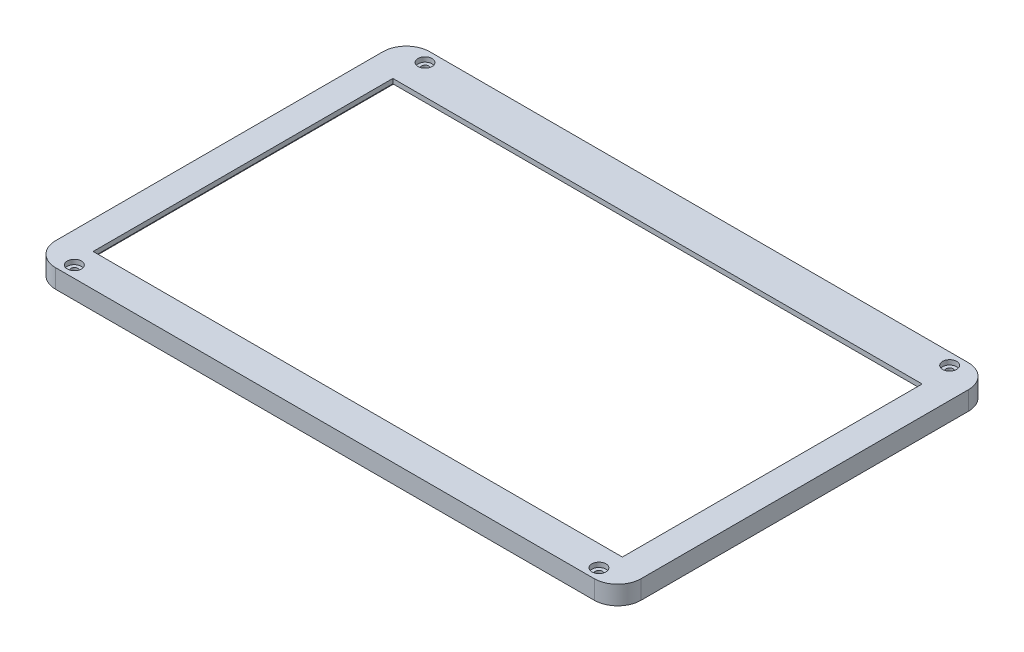
ISO-10303-21;
HEADER;
FILE_DESCRIPTION(('STEP AP214'),'2;1');
FILE_NAME('part.step','',(''),(''),'','','');
FILE_SCHEMA(('AUTOMOTIVE_DESIGN { 1 0 10303 214 1 1 1 1 }'));
ENDSEC;
DATA;
#1=APPLICATION_CONTEXT('core data for automotive mechanical design processes');
#2=APPLICATION_PROTOCOL_DEFINITION('international standard','automotive_design',2000,#1);
#3=PRODUCT_CONTEXT('',#1,'mechanical');
#4=PRODUCT('Part','Part','',(#3));
#5=PRODUCT_RELATED_PRODUCT_CATEGORY('part','',(#4));
#6=PRODUCT_DEFINITION_FORMATION('','',#4);
#7=PRODUCT_DEFINITION_CONTEXT('part definition',#1,'design');
#8=PRODUCT_DEFINITION('design','',#6,#7);
#9=PRODUCT_DEFINITION_SHAPE('','',#8);
#10=(LENGTH_UNIT() NAMED_UNIT(*) SI_UNIT(.MILLI.,.METRE.));
#11=(NAMED_UNIT(*) PLANE_ANGLE_UNIT() SI_UNIT($,.RADIAN.));
#12=(NAMED_UNIT(*) SI_UNIT($,.STERADIAN.) SOLID_ANGLE_UNIT());
#13=UNCERTAINTY_MEASURE_WITH_UNIT(LENGTH_MEASURE(1.E-05),#10,'distance_accuracy_value','');
#14=(GEOMETRIC_REPRESENTATION_CONTEXT(3) GLOBAL_UNCERTAINTY_ASSIGNED_CONTEXT((#13)) GLOBAL_UNIT_ASSIGNED_CONTEXT((#10,
#11,#12)) REPRESENTATION_CONTEXT('',''));
#15=CARTESIAN_POINT('',(0.,0.,0.));
#16=DIRECTION('',(0.,0.,1.));
#17=DIRECTION('',(1.,0.,0.));
#18=AXIS2_PLACEMENT_3D('',#15,#16,#17);
#19=CARTESIAN_POINT('',(-86.3406720741599,10.,87.8980301274625));
#20=DIRECTION('',(0.,-1.,0.));
#21=DIRECTION('',(0.,0.,-1.));
#22=AXIS2_PLACEMENT_3D('',#19,#20,#21);
#23=CYLINDRICAL_SURFACE('',#22,1.5);
#24=CARTESIAN_POINT('',(-86.3406720741599,0.,87.8980301274625));
#25=DIRECTION('',(0.,-1.,0.));
#26=DIRECTION('',(0.,0.,-1.));
#27=AXIS2_PLACEMENT_3D('',#24,#25,#26);
#28=CIRCLE('',#27,1.5);
#29=CARTESIAN_POINT('',(-86.3406720741599,0.,86.3980301274625));
#30=VERTEX_POINT('',#29);
#31=EDGE_CURVE('E338',#30,#30,#28,.T.);
#32=ORIENTED_EDGE('',*,*,#31,.T.);
#33=EDGE_LOOP('',(#32));
#34=FACE_BOUND('',#33,.T.);
#35=CARTESIAN_POINT('',(-86.3406720741599,6.,87.8980301274625));
#36=DIRECTION('',(0.,1.,0.));
#37=DIRECTION('',(0.,0.,1.));
#38=AXIS2_PLACEMENT_3D('',#35,#36,#37);
#39=CIRCLE('',#38,1.5);
#40=CARTESIAN_POINT('',(-86.3406720741599,6.,89.3980301274625));
#41=VERTEX_POINT('',#40);
#42=EDGE_CURVE('E43',#41,#41,#39,.F.);
#43=ORIENTED_EDGE('',*,*,#42,.F.);
#44=EDGE_LOOP('',(#43));
#45=FACE_BOUND('',#44,.T.);
#46=ADVANCED_FACE('F39',(#34,#45),#23,.F.);
#47=CARTESIAN_POINT('',(137.65932792584,10.,87.8980301274625));
#48=DIRECTION('',(0.,-1.,0.));
#49=DIRECTION('',(0.,0.,-1.));
#50=AXIS2_PLACEMENT_3D('',#47,#48,#49);
#51=CYLINDRICAL_SURFACE('',#50,1.5);
#52=CARTESIAN_POINT('',(137.65932792584,0.,87.8980301274625));
#53=DIRECTION('',(0.,-1.,0.));
#54=DIRECTION('',(0.,0.,-1.));
#55=AXIS2_PLACEMENT_3D('',#52,#53,#54);
#56=CIRCLE('',#55,1.5);
#57=CARTESIAN_POINT('',(137.65932792584,0.,86.3980301274625));
#58=VERTEX_POINT('',#57);
#59=EDGE_CURVE('E334',#58,#58,#56,.T.);
#60=ORIENTED_EDGE('',*,*,#59,.T.);
#61=EDGE_LOOP('',(#60));
#62=FACE_BOUND('',#61,.T.);
#63=CARTESIAN_POINT('',(137.65932792584,6.,87.8980301274625));
#64=DIRECTION('',(0.,1.,0.));
#65=DIRECTION('',(0.,0.,1.));
#66=AXIS2_PLACEMENT_3D('',#63,#64,#65);
#67=CIRCLE('',#66,1.5);
#68=CARTESIAN_POINT('',(137.65932792584,6.,89.3980301274625));
#69=VERTEX_POINT('',#68);
#70=EDGE_CURVE('E316',#69,#69,#67,.F.);
#71=ORIENTED_EDGE('',*,*,#70,.F.);
#72=EDGE_LOOP('',(#71));
#73=FACE_BOUND('',#72,.T.);
#74=ADVANCED_FACE('F395',(#62,#73),#51,.F.);
#75=CARTESIAN_POINT('',(137.65932792584,10.,-61.8519698725375));
#76=DIRECTION('',(0.,-1.,0.));
#77=DIRECTION('',(0.,0.,-1.));
#78=AXIS2_PLACEMENT_3D('',#75,#76,#77);
#79=CYLINDRICAL_SURFACE('',#78,1.5);
#80=CARTESIAN_POINT('',(137.65932792584,0.,-61.8519698725375));
#81=DIRECTION('',(0.,-1.,0.));
#82=DIRECTION('',(0.,0.,-1.));
#83=AXIS2_PLACEMENT_3D('',#80,#81,#82);
#84=CIRCLE('',#83,1.5);
#85=CARTESIAN_POINT('',(137.65932792584,0.,-63.3519698725375));
#86=VERTEX_POINT('',#85);
#87=EDGE_CURVE('E328',#86,#86,#84,.T.);
#88=ORIENTED_EDGE('',*,*,#87,.T.);
#89=EDGE_LOOP('',(#88));
#90=FACE_BOUND('',#89,.T.);
#91=CARTESIAN_POINT('',(137.65932792584,6.,-61.8519698725375));
#92=DIRECTION('',(0.,1.,0.));
#93=DIRECTION('',(0.,0.,1.));
#94=AXIS2_PLACEMENT_3D('',#91,#92,#93);
#95=CIRCLE('',#94,1.5);
#96=CARTESIAN_POINT('',(137.65932792584,6.,-60.3519698725375));
#97=VERTEX_POINT('',#96);
#98=EDGE_CURVE('E312',#97,#97,#95,.F.);
#99=ORIENTED_EDGE('',*,*,#98,.F.);
#100=EDGE_LOOP('',(#99));
#101=FACE_BOUND('',#100,.T.);
#102=ADVANCED_FACE('F401',(#90,#101),#79,.F.);
#103=CARTESIAN_POINT('',(-86.3406720741599,10.,-61.8519698725375));
#104=DIRECTION('',(0.,-1.,0.));
#105=DIRECTION('',(0.,0.,-1.));
#106=AXIS2_PLACEMENT_3D('',#103,#104,#105);
#107=CYLINDRICAL_SURFACE('',#106,1.5);
#108=CARTESIAN_POINT('',(-86.3406720741599,0.,-61.8519698725375));
#109=DIRECTION('',(0.,-1.,0.));
#110=DIRECTION('',(0.,0.,-1.));
#111=AXIS2_PLACEMENT_3D('',#108,#109,#110);
#112=CIRCLE('',#111,1.5);
#113=CARTESIAN_POINT('',(-86.3406720741599,0.,-63.3519698725375));
#114=VERTEX_POINT('',#113);
#115=EDGE_CURVE('E323',#114,#114,#112,.T.);
#116=ORIENTED_EDGE('',*,*,#115,.T.);
#117=EDGE_LOOP('',(#116));
#118=FACE_BOUND('',#117,.T.);
#119=CARTESIAN_POINT('',(-86.3406720741599,6.,-61.8519698725375));
#120=DIRECTION('',(0.,1.,0.));
#121=DIRECTION('',(0.,0.,1.));
#122=AXIS2_PLACEMENT_3D('',#119,#120,#121);
#123=CIRCLE('',#122,1.5);
#124=CARTESIAN_POINT('',(-86.3406720741599,6.,-60.3519698725375));
#125=VERTEX_POINT('',#124);
#126=EDGE_CURVE('E308',#125,#125,#123,.F.);
#127=ORIENTED_EDGE('',*,*,#126,.F.);
#128=EDGE_LOOP('',(#127));
#129=FACE_BOUND('',#128,.T.);
#130=ADVANCED_FACE('F407',(#118,#129),#107,.F.);
#131=CARTESIAN_POINT('',(0.,8.,0.));
#132=DIRECTION('',(0.,1.,0.));
#133=DIRECTION('',(0.,0.,1.));
#134=AXIS2_PLACEMENT_3D('',#131,#132,#133);
#135=PLANE('',#134);
#136=CARTESIAN_POINT('',(-86.3406720741599,8.,87.8980301274625));
#137=DIRECTION('',(0.,1.,0.));
#138=DIRECTION('',(0.,0.,1.));
#139=AXIS2_PLACEMENT_3D('',#136,#137,#138);
#140=CIRCLE('',#139,3.00000000000001);
#141=CARTESIAN_POINT('',(-86.3406720741599,8.,90.8980301274625));
#142=VERTEX_POINT('',#141);
#143=EDGE_CURVE('E487',#142,#142,#140,.T.);
#144=ORIENTED_EDGE('',*,*,#143,.F.);
#145=EDGE_LOOP('',(#144));
#146=FACE_BOUND('',#145,.T.);
#147=CARTESIAN_POINT('',(137.65932792584,8.,87.8980301274625));
#148=DIRECTION('',(0.,1.,0.));
#149=DIRECTION('',(0.,0.,1.));
#150=AXIS2_PLACEMENT_3D('',#147,#148,#149);
#151=CIRCLE('',#150,2.99999999999999);
#152=CARTESIAN_POINT('',(137.65932792584,8.,90.8980301274625));
#153=VERTEX_POINT('',#152);
#154=EDGE_CURVE('E495',#153,#153,#151,.T.);
#155=ORIENTED_EDGE('',*,*,#154,.F.);
#156=EDGE_LOOP('',(#155));
#157=FACE_BOUND('',#156,.T.);
#158=CARTESIAN_POINT('',(137.65932792584,8.,-61.8519698725375));
#159=DIRECTION('',(0.,1.,0.));
#160=DIRECTION('',(0.,0.,1.));
#161=AXIS2_PLACEMENT_3D('',#158,#159,#160);
#162=CIRCLE('',#161,2.99999999999999);
#163=CARTESIAN_POINT('',(137.65932792584,8.,-58.8519698725375));
#164=VERTEX_POINT('',#163);
#165=EDGE_CURVE('E503',#164,#164,#162,.T.);
#166=ORIENTED_EDGE('',*,*,#165,.F.);
#167=EDGE_LOOP('',(#166));
#168=FACE_BOUND('',#167,.T.);
#169=CARTESIAN_POINT('',(-86.3406720741599,8.,-61.8519698725375));
#170=DIRECTION('',(0.,1.,0.));
#171=DIRECTION('',(0.,0.,1.));
#172=AXIS2_PLACEMENT_3D('',#169,#170,#171);
#173=CIRCLE('',#172,3.00000000000001);
#174=CARTESIAN_POINT('',(-86.3406720741599,8.,-58.8519698725375));
#175=VERTEX_POINT('',#174);
#176=EDGE_CURVE('E479',#175,#175,#173,.T.);
#177=ORIENTED_EDGE('',*,*,#176,.F.);
#178=EDGE_LOOP('',(#177));
#179=FACE_BOUND('',#178,.T.);
#180=DIRECTION('',(1.,0.,0.));
#181=VECTOR('',#180,1.);
#182=CARTESIAN_POINT('',(-87.3406720741599,8.,78.8980301274625));
#183=LINE('',#182,#181);
#184=CARTESIAN_POINT('',(-87.3406720741599,8.,78.8980301274625));
#185=VERTEX_POINT('',#184);
#186=CARTESIAN_POINT('',(138.65932792584,8.,78.8980301274625));
#187=VERTEX_POINT('',#186);
#188=EDGE_CURVE('E253',#185,#187,#183,.T.);
#189=ORIENTED_EDGE('',*,*,#188,.F.);
#190=DIRECTION('',(0.,0.,1.));
#191=VECTOR('',#190,1.);
#192=CARTESIAN_POINT('',(-87.3406720741599,8.,-49.1019698725375));
#193=LINE('',#192,#191);
#194=CARTESIAN_POINT('',(-87.3406720741599,8.,-49.1019698725375));
#195=VERTEX_POINT('',#194);
#196=EDGE_CURVE('E250',#195,#185,#193,.T.);
#197=ORIENTED_EDGE('',*,*,#196,.F.);
#198=DIRECTION('',(-1.,0.,0.));
#199=VECTOR('',#198,1.);
#200=CARTESIAN_POINT('',(-87.3406720741599,8.,-49.1019698725375));
#201=LINE('',#200,#199);
#202=CARTESIAN_POINT('',(138.65932792584,8.,-49.1019698725375));
#203=VERTEX_POINT('',#202);
#204=EDGE_CURVE('E260',#203,#195,#201,.T.);
#205=ORIENTED_EDGE('',*,*,#204,.F.);
#206=DIRECTION('',(0.,0.,-1.));
#207=VECTOR('',#206,1.);
#208=CARTESIAN_POINT('',(138.65932792584,8.,-49.1019698725375));
#209=LINE('',#208,#207);
#210=EDGE_CURVE('E256',#187,#203,#209,.T.);
#211=ORIENTED_EDGE('',*,*,#210,.F.);
#212=EDGE_LOOP('',(#189,#197,#205,#211));
#213=FACE_BOUND('',#212,.T.);
#214=CARTESIAN_POINT('',(140.65932792584,8.,82.8980301274625));
#215=DIRECTION('',(0.,1.,0.));
#216=DIRECTION('',(0.,0.,1.));
#217=AXIS2_PLACEMENT_3D('',#214,#215,#216);
#218=CIRCLE('',#217,10.);
#219=CARTESIAN_POINT('',(150.65932792584,8.,82.8980301274624));
#220=VERTEX_POINT('',#219);
#221=CARTESIAN_POINT('',(140.65932792584,8.,92.8980301274625));
#222=VERTEX_POINT('',#221);
#223=EDGE_CURVE('E191',#220,#222,#218,.F.);
#224=ORIENTED_EDGE('',*,*,#223,.F.);
#225=DIRECTION('',(0.,0.,-1.));
#226=VECTOR('',#225,1.);
#227=CARTESIAN_POINT('',(150.65932792584,8.,-63.1019698725375));
#228=LINE('',#227,#226);
#229=CARTESIAN_POINT('',(150.65932792584,8.,-56.8519698725374));
#230=VERTEX_POINT('',#229);
#231=EDGE_CURVE('E288',#220,#230,#228,.T.);
#232=ORIENTED_EDGE('',*,*,#231,.T.);
#233=CARTESIAN_POINT('',(140.65932792584,8.,-56.8519698725375));
#234=DIRECTION('',(0.,1.,0.));
#235=DIRECTION('',(0.,0.,1.));
#236=AXIS2_PLACEMENT_3D('',#233,#234,#235);
#237=CIRCLE('',#236,10.);
#238=CARTESIAN_POINT('',(140.65932792584,8.,-66.8519698725375));
#239=VERTEX_POINT('',#238);
#240=EDGE_CURVE('E361',#239,#230,#237,.F.);
#241=ORIENTED_EDGE('',*,*,#240,.F.);
#242=DIRECTION('',(1.,0.,0.));
#243=VECTOR('',#242,1.);
#244=CARTESIAN_POINT('',(150.65932792584,8.,-66.8519698725375));
#245=LINE('',#244,#243);
#246=CARTESIAN_POINT('',(-89.3406720741599,8.,-66.8519698725375));
#247=VERTEX_POINT('',#246);
#248=EDGE_CURVE('E184',#247,#239,#245,.T.);
#249=ORIENTED_EDGE('',*,*,#248,.F.);
#250=CARTESIAN_POINT('',(-89.3406720741599,8.,-56.8519698725375));
#251=DIRECTION('',(0.,1.,0.));
#252=DIRECTION('',(0.,0.,1.));
#253=AXIS2_PLACEMENT_3D('',#250,#251,#252);
#254=CIRCLE('',#253,9.99999999999999);
#255=CARTESIAN_POINT('',(-99.3406720741599,8.,-56.8519698725374));
#256=VERTEX_POINT('',#255);
#257=EDGE_CURVE('E159',#256,#247,#254,.F.);
#258=ORIENTED_EDGE('',*,*,#257,.F.);
#259=DIRECTION('',(0.,0.,1.));
#260=VECTOR('',#259,1.);
#261=CARTESIAN_POINT('',(-99.3406720741599,8.,-63.1019698725375));
#262=LINE('',#261,#260);
#263=CARTESIAN_POINT('',(-99.3406720741599,8.,82.8980301274624));
#264=VERTEX_POINT('',#263);
#265=EDGE_CURVE('E279',#256,#264,#262,.T.);
#266=ORIENTED_EDGE('',*,*,#265,.T.);
#267=CARTESIAN_POINT('',(-89.3406720741599,8.,82.8980301274625));
#268=DIRECTION('',(0.,1.,0.));
#269=DIRECTION('',(0.,0.,1.));
#270=AXIS2_PLACEMENT_3D('',#267,#268,#269);
#271=CIRCLE('',#270,9.99999999999999);
#272=CARTESIAN_POINT('',(-89.3406720741598,8.,92.8980301274625));
#273=VERTEX_POINT('',#272);
#274=EDGE_CURVE('E185',#273,#264,#271,.F.);
#275=ORIENTED_EDGE('',*,*,#274,.F.);
#276=DIRECTION('',(1.,0.,0.));
#277=VECTOR('',#276,1.);
#278=CARTESIAN_POINT('',(-99.3406720741599,8.,92.8980301274625));
#279=LINE('',#278,#277);
#280=EDGE_CURVE('E283',#273,#222,#279,.T.);
#281=ORIENTED_EDGE('',*,*,#280,.T.);
#282=EDGE_LOOP('',(#224,#232,#241,#249,#258,#266,#275,#281));
#283=FACE_BOUND('',#282,.T.);
#284=ADVANCED_FACE('F374',(#146,#157,#168,#179,#213,#283),#135,.T.);
#285=CARTESIAN_POINT('',(0.,0.,0.));
#286=DIRECTION('',(0.,1.,0.));
#287=DIRECTION('',(0.,0.,1.));
#288=AXIS2_PLACEMENT_3D('',#285,#286,#287);
#289=PLANE('',#288);
#290=ORIENTED_EDGE('',*,*,#115,.F.);
#291=EDGE_LOOP('',(#290));
#292=FACE_BOUND('',#291,.T.);
#293=ORIENTED_EDGE('',*,*,#87,.F.);
#294=EDGE_LOOP('',(#293));
#295=FACE_BOUND('',#294,.T.);
#296=ORIENTED_EDGE('',*,*,#59,.F.);
#297=EDGE_LOOP('',(#296));
#298=FACE_BOUND('',#297,.T.);
#299=ORIENTED_EDGE('',*,*,#31,.F.);
#300=EDGE_LOOP('',(#299));
#301=FACE_BOUND('',#300,.T.);
#302=DIRECTION('',(1.,0.,0.));
#303=VECTOR('',#302,1.);
#304=CARTESIAN_POINT('',(-93.0906720741599,0.,-56.8519698725375));
#305=LINE('',#304,#303);
#306=CARTESIAN_POINT('',(-93.0906720741599,0.,-56.8519698725375));
#307=VERTEX_POINT('',#306);
#308=CARTESIAN_POINT('',(142.40932792584,0.,-56.8519698725375));
#309=VERTEX_POINT('',#308);
#310=EDGE_CURVE('E215',#307,#309,#305,.T.);
#311=ORIENTED_EDGE('',*,*,#310,.F.);
#312=DIRECTION('',(0.,0.,-1.));
#313=VECTOR('',#312,1.);
#314=CARTESIAN_POINT('',(-93.0906720741599,0.,82.6480301274625));
#315=LINE('',#314,#313);
#316=CARTESIAN_POINT('',(-93.0906720741599,0.,82.6480301274625));
#317=VERTEX_POINT('',#316);
#318=EDGE_CURVE('E189',#317,#307,#315,.T.);
#319=ORIENTED_EDGE('',*,*,#318,.F.);
#320=DIRECTION('',(-1.,0.,0.));
#321=VECTOR('',#320,1.);
#322=CARTESIAN_POINT('',(-93.0906720741599,0.,82.6480301274625));
#323=LINE('',#322,#321);
#324=CARTESIAN_POINT('',(142.40932792584,0.,82.6480301274625));
#325=VERTEX_POINT('',#324);
#326=EDGE_CURVE('E200',#325,#317,#323,.T.);
#327=ORIENTED_EDGE('',*,*,#326,.F.);
#328=DIRECTION('',(0.,0.,1.));
#329=VECTOR('',#328,1.);
#330=CARTESIAN_POINT('',(142.40932792584,0.,82.6480301274625));
#331=LINE('',#330,#329);
#332=EDGE_CURVE('E219',#309,#325,#331,.T.);
#333=ORIENTED_EDGE('',*,*,#332,.F.);
#334=EDGE_LOOP('',(#311,#319,#327,#333));
#335=FACE_BOUND('',#334,.T.);
#336=DIRECTION('',(0.,0.,-1.));
#337=VECTOR('',#336,1.);
#338=CARTESIAN_POINT('',(150.65932792584,0.,-63.1019698725375));
#339=LINE('',#338,#337);
#340=CARTESIAN_POINT('',(150.65932792584,0.,82.8980301274624));
#341=VERTEX_POINT('',#340);
#342=CARTESIAN_POINT('',(150.65932792584,0.,-56.8519698725374));
#343=VERTEX_POINT('',#342);
#344=EDGE_CURVE('E284',#341,#343,#339,.T.);
#345=ORIENTED_EDGE('',*,*,#344,.F.);
#346=CARTESIAN_POINT('',(140.65932792584,0.,82.8980301274625));
#347=DIRECTION('',(0.,1.,0.));
#348=DIRECTION('',(0.,0.,1.));
#349=AXIS2_PLACEMENT_3D('',#346,#347,#348);
#350=CIRCLE('',#349,10.);
#351=CARTESIAN_POINT('',(140.65932792584,0.,92.8980301274625));
#352=VERTEX_POINT('',#351);
#353=EDGE_CURVE('E64',#352,#341,#350,.T.);
#354=ORIENTED_EDGE('',*,*,#353,.F.);
#355=DIRECTION('',(1.,0.,0.));
#356=VECTOR('',#355,1.);
#357=CARTESIAN_POINT('',(-99.3406720741599,0.,92.8980301274625));
#358=LINE('',#357,#356);
#359=CARTESIAN_POINT('',(-89.3406720741598,0.,92.8980301274625));
#360=VERTEX_POINT('',#359);
#361=EDGE_CURVE('E294',#360,#352,#358,.T.);
#362=ORIENTED_EDGE('',*,*,#361,.F.);
#363=CARTESIAN_POINT('',(-89.3406720741599,0.,82.8980301274625));
#364=DIRECTION('',(0.,1.,0.));
#365=DIRECTION('',(0.,0.,1.));
#366=AXIS2_PLACEMENT_3D('',#363,#364,#365);
#367=CIRCLE('',#366,9.99999999999999);
#368=CARTESIAN_POINT('',(-99.3406720741599,0.,82.8980301274624));
#369=VERTEX_POINT('',#368);
#370=EDGE_CURVE('E56',#369,#360,#367,.T.);
#371=ORIENTED_EDGE('',*,*,#370,.F.);
#372=DIRECTION('',(0.,0.,1.));
#373=VECTOR('',#372,1.);
#374=CARTESIAN_POINT('',(-99.3406720741599,0.,-63.1019698725375));
#375=LINE('',#374,#373);
#376=CARTESIAN_POINT('',(-99.3406720741599,0.,-56.8519698725374));
#377=VERTEX_POINT('',#376);
#378=EDGE_CURVE('E176',#377,#369,#375,.T.);
#379=ORIENTED_EDGE('',*,*,#378,.F.);
#380=CARTESIAN_POINT('',(-89.3406720741599,0.,-56.8519698725375));
#381=DIRECTION('',(0.,1.,0.));
#382=DIRECTION('',(0.,0.,1.));
#383=AXIS2_PLACEMENT_3D('',#380,#381,#382);
#384=CIRCLE('',#383,9.99999999999999);
#385=CARTESIAN_POINT('',(-89.3406720741598,0.,-66.8519698725375));
#386=VERTEX_POINT('',#385);
#387=EDGE_CURVE('E156',#386,#377,#384,.T.);
#388=ORIENTED_EDGE('',*,*,#387,.F.);
#389=DIRECTION('',(-1.,0.,0.));
#390=VECTOR('',#389,1.);
#391=CARTESIAN_POINT('',(150.65932792584,0.,-66.8519698725375));
#392=LINE('',#391,#390);
#393=CARTESIAN_POINT('',(140.65932792584,0.,-66.8519698725375));
#394=VERTEX_POINT('',#393);
#395=EDGE_CURVE('E174',#394,#386,#392,.T.);
#396=ORIENTED_EDGE('',*,*,#395,.F.);
#397=CARTESIAN_POINT('',(140.65932792584,0.,-56.8519698725375));
#398=DIRECTION('',(0.,1.,0.));
#399=DIRECTION('',(0.,0.,1.));
#400=AXIS2_PLACEMENT_3D('',#397,#398,#399);
#401=CIRCLE('',#400,10.);
#402=EDGE_CURVE('E344',#343,#394,#401,.T.);
#403=ORIENTED_EDGE('',*,*,#402,.F.);
#404=EDGE_LOOP('',(#345,#354,#362,#371,#379,#388,#396,#403));
#405=FACE_BOUND('',#404,.T.);
#406=ADVANCED_FACE('F172',(#292,#295,#298,#301,#335,#405),#289,.F.);
#407=CARTESIAN_POINT('',(-99.3406720741599,8.,-63.1019698725375));
#408=DIRECTION('',(1.,0.,0.));
#409=DIRECTION('',(0.,0.,-1.));
#410=AXIS2_PLACEMENT_3D('',#407,#408,#409);
#411=PLANE('',#410);
#412=DIRECTION('',(0.,-1.,0.));
#413=VECTOR('',#412,1.);
#414=CARTESIAN_POINT('',(-99.3406720741599,10.,-56.8519698725374));
#415=LINE('',#414,#413);
#416=EDGE_CURVE('E178',#256,#377,#415,.T.);
#417=ORIENTED_EDGE('',*,*,#416,.T.);
#418=ORIENTED_EDGE('',*,*,#378,.T.);
#419=DIRECTION('',(0.,-1.,0.));
#420=VECTOR('',#419,1.);
#421=CARTESIAN_POINT('',(-99.3406720741599,10.,82.8980301274624));
#422=LINE('',#421,#420);
#423=EDGE_CURVE('E356',#264,#369,#422,.T.);
#424=ORIENTED_EDGE('',*,*,#423,.F.);
#425=ORIENTED_EDGE('',*,*,#265,.F.);
#426=EDGE_LOOP('',(#417,#418,#424,#425));
#427=FACE_BOUND('',#426,.T.);
#428=ADVANCED_FACE('F41',(#427),#411,.F.);
#429=CARTESIAN_POINT('',(-99.3406720741599,8.,92.8980301274625));
#430=DIRECTION('',(0.,0.,-1.));
#431=DIRECTION('',(-1.,0.,0.));
#432=AXIS2_PLACEMENT_3D('',#429,#430,#431);
#433=PLANE('',#432);
#434=ORIENTED_EDGE('',*,*,#361,.T.);
#435=DIRECTION('',(0.,-1.,0.));
#436=VECTOR('',#435,1.);
#437=CARTESIAN_POINT('',(140.65932792584,10.,92.8980301274625));
#438=LINE('',#437,#436);
#439=EDGE_CURVE('E347',#222,#352,#438,.T.);
#440=ORIENTED_EDGE('',*,*,#439,.F.);
#441=ORIENTED_EDGE('',*,*,#280,.F.);
#442=DIRECTION('',(0.,-1.,0.));
#443=VECTOR('',#442,1.);
#444=CARTESIAN_POINT('',(-89.3406720741599,10.,92.8980301274625));
#445=LINE('',#444,#443);
#446=EDGE_CURVE('E11',#360,#273,#445,.F.);
#447=ORIENTED_EDGE('',*,*,#446,.F.);
#448=EDGE_LOOP('',(#434,#440,#441,#447));
#449=FACE_BOUND('',#448,.T.);
#450=ADVANCED_FACE('F371',(#449),#433,.F.);
#451=CARTESIAN_POINT('',(150.65932792584,8.,-63.1019698725375));
#452=DIRECTION('',(-1.,0.,0.));
#453=DIRECTION('',(0.,0.,1.));
#454=AXIS2_PLACEMENT_3D('',#451,#452,#453);
#455=PLANE('',#454);
#456=DIRECTION('',(0.,-1.,0.));
#457=VECTOR('',#456,1.);
#458=CARTESIAN_POINT('',(150.65932792584,10.,82.8980301274625));
#459=LINE('',#458,#457);
#460=EDGE_CURVE('E49',#341,#220,#459,.F.);
#461=ORIENTED_EDGE('',*,*,#460,.F.);
#462=ORIENTED_EDGE('',*,*,#344,.T.);
#463=DIRECTION('',(0.,-1.,0.));
#464=VECTOR('',#463,1.);
#465=CARTESIAN_POINT('',(150.65932792584,10.,-56.8519698725374));
#466=LINE('',#465,#464);
#467=EDGE_CURVE('E179',#230,#343,#466,.T.);
#468=ORIENTED_EDGE('',*,*,#467,.F.);
#469=ORIENTED_EDGE('',*,*,#231,.F.);
#470=EDGE_LOOP('',(#461,#462,#468,#469));
#471=FACE_BOUND('',#470,.T.);
#472=ADVANCED_FACE('F384',(#471),#455,.F.);
#473=CARTESIAN_POINT('',(0.,0.,-66.8519698725375));
#474=DIRECTION('',(0.,0.,-1.));
#475=DIRECTION('',(-1.,0.,0.));
#476=AXIS2_PLACEMENT_3D('',#473,#474,#475);
#477=PLANE('',#476);
#478=DIRECTION('',(0.,-1.,0.));
#479=VECTOR('',#478,1.);
#480=CARTESIAN_POINT('',(140.65932792584,10.,-66.8519698725375));
#481=LINE('',#480,#479);
#482=EDGE_CURVE('E165',#394,#239,#481,.F.);
#483=ORIENTED_EDGE('',*,*,#482,.F.);
#484=ORIENTED_EDGE('',*,*,#395,.T.);
#485=DIRECTION('',(0.,-1.,0.));
#486=VECTOR('',#485,1.);
#487=CARTESIAN_POINT('',(-89.3406720741599,10.,-66.8519698725375));
#488=LINE('',#487,#486);
#489=EDGE_CURVE('E153',#386,#247,#488,.F.);
#490=ORIENTED_EDGE('',*,*,#489,.T.);
#491=ORIENTED_EDGE('',*,*,#248,.T.);
#492=EDGE_LOOP('',(#483,#484,#490,#491));
#493=FACE_BOUND('',#492,.T.);
#494=ADVANCED_FACE('F182',(#493),#477,.T.);
#495=CARTESIAN_POINT('',(-87.3406720741599,8.,-49.1019698725375));
#496=DIRECTION('',(1.,0.,0.));
#497=DIRECTION('',(0.,0.,-1.));
#498=AXIS2_PLACEMENT_3D('',#495,#496,#497);
#499=PLANE('',#498);
#500=DIRECTION('',(0.,-1.,0.));
#501=VECTOR('',#500,1.);
#502=CARTESIAN_POINT('',(-87.3406720741599,8.,78.8980301274625));
#503=LINE('',#502,#501);
#504=CARTESIAN_POINT('',(-87.3406720741599,6.,78.8980301274625));
#505=VERTEX_POINT('',#504);
#506=EDGE_CURVE('E275',#185,#505,#503,.T.);
#507=ORIENTED_EDGE('',*,*,#506,.T.);
#508=DIRECTION('',(0.,0.,-1.));
#509=VECTOR('',#508,1.);
#510=CARTESIAN_POINT('',(-87.3406720741599,6.,-49.1019698725375));
#511=LINE('',#510,#509);
#512=CARTESIAN_POINT('',(-87.3406720741599,6.,-49.1019698725375));
#513=VERTEX_POINT('',#512);
#514=EDGE_CURVE('E246',#505,#513,#511,.T.);
#515=ORIENTED_EDGE('',*,*,#514,.T.);
#516=DIRECTION('',(0.,-1.,0.));
#517=VECTOR('',#516,1.);
#518=CARTESIAN_POINT('',(-87.3406720741599,8.,-49.1019698725375));
#519=LINE('',#518,#517);
#520=EDGE_CURVE('E263',#195,#513,#519,.T.);
#521=ORIENTED_EDGE('',*,*,#520,.F.);
#522=ORIENTED_EDGE('',*,*,#196,.T.);
#523=EDGE_LOOP('',(#507,#515,#521,#522));
#524=FACE_BOUND('',#523,.T.);
#525=ADVANCED_FACE('F391',(#524),#499,.T.);
#526=CARTESIAN_POINT('',(-87.3406720741599,8.,78.8980301274625));
#527=DIRECTION('',(0.,0.,-1.));
#528=DIRECTION('',(-1.,0.,0.));
#529=AXIS2_PLACEMENT_3D('',#526,#527,#528);
#530=PLANE('',#529);
#531=DIRECTION('',(0.,-1.,0.));
#532=VECTOR('',#531,1.);
#533=CARTESIAN_POINT('',(138.65932792584,8.,78.8980301274625));
#534=LINE('',#533,#532);
#535=CARTESIAN_POINT('',(138.65932792584,6.,78.8980301274625));
#536=VERTEX_POINT('',#535);
#537=EDGE_CURVE('E271',#187,#536,#534,.T.);
#538=ORIENTED_EDGE('',*,*,#537,.T.);
#539=DIRECTION('',(-1.,0.,0.));
#540=VECTOR('',#539,1.);
#541=CARTESIAN_POINT('',(-87.3406720741599,6.,78.8980301274625));
#542=LINE('',#541,#540);
#543=EDGE_CURVE('E242',#536,#505,#542,.T.);
#544=ORIENTED_EDGE('',*,*,#543,.T.);
#545=ORIENTED_EDGE('',*,*,#506,.F.);
#546=ORIENTED_EDGE('',*,*,#188,.T.);
#547=EDGE_LOOP('',(#538,#544,#545,#546));
#548=FACE_BOUND('',#547,.T.);
#549=ADVANCED_FACE('F445',(#548),#530,.T.);
#550=CARTESIAN_POINT('',(138.65932792584,8.,-49.1019698725375));
#551=DIRECTION('',(-1.,0.,0.));
#552=DIRECTION('',(0.,0.,1.));
#553=AXIS2_PLACEMENT_3D('',#550,#551,#552);
#554=PLANE('',#553);
#555=DIRECTION('',(0.,-1.,0.));
#556=VECTOR('',#555,1.);
#557=CARTESIAN_POINT('',(138.65932792584,8.,-49.1019698725375));
#558=LINE('',#557,#556);
#559=CARTESIAN_POINT('',(138.65932792584,6.,-49.1019698725375));
#560=VERTEX_POINT('',#559);
#561=EDGE_CURVE('E267',#203,#560,#558,.T.);
#562=ORIENTED_EDGE('',*,*,#561,.T.);
#563=DIRECTION('',(0.,0.,1.));
#564=VECTOR('',#563,1.);
#565=CARTESIAN_POINT('',(138.65932792584,6.,-49.1019698725375));
#566=LINE('',#565,#564);
#567=EDGE_CURVE('E229',#560,#536,#566,.T.);
#568=ORIENTED_EDGE('',*,*,#567,.T.);
#569=ORIENTED_EDGE('',*,*,#537,.F.);
#570=ORIENTED_EDGE('',*,*,#210,.T.);
#571=EDGE_LOOP('',(#562,#568,#569,#570));
#572=FACE_BOUND('',#571,.T.);
#573=ADVANCED_FACE('F441',(#572),#554,.T.);
#574=CARTESIAN_POINT('',(-87.3406720741599,8.,-49.1019698725375));
#575=DIRECTION('',(0.,0.,1.));
#576=DIRECTION('',(1.,0.,0.));
#577=AXIS2_PLACEMENT_3D('',#574,#575,#576);
#578=PLANE('',#577);
#579=ORIENTED_EDGE('',*,*,#520,.T.);
#580=DIRECTION('',(1.,0.,0.));
#581=VECTOR('',#580,1.);
#582=CARTESIAN_POINT('',(-87.3406720741599,6.,-49.1019698725375));
#583=LINE('',#582,#581);
#584=EDGE_CURVE('E166',#513,#560,#583,.T.);
#585=ORIENTED_EDGE('',*,*,#584,.T.);
#586=ORIENTED_EDGE('',*,*,#561,.F.);
#587=ORIENTED_EDGE('',*,*,#204,.T.);
#588=EDGE_LOOP('',(#579,#585,#586,#587));
#589=FACE_BOUND('',#588,.T.);
#590=ADVANCED_FACE('F437',(#589),#578,.T.);
#591=CARTESIAN_POINT('',(-93.0906720741599,6.,82.6480301274625));
#592=DIRECTION('',(-1.,0.,0.));
#593=DIRECTION('',(0.,0.,1.));
#594=AXIS2_PLACEMENT_3D('',#591,#592,#593);
#595=PLANE('',#594);
#596=ORIENTED_EDGE('',*,*,#318,.T.);
#597=DIRECTION('',(0.,-1.,0.));
#598=VECTOR('',#597,1.);
#599=CARTESIAN_POINT('',(-93.0906720741599,6.,-56.8519698725375));
#600=LINE('',#599,#598);
#601=CARTESIAN_POINT('',(-93.0906720741599,6.,-56.8519698725375));
#602=VERTEX_POINT('',#601);
#603=EDGE_CURVE('E212',#602,#307,#600,.T.);
#604=ORIENTED_EDGE('',*,*,#603,.F.);
#605=DIRECTION('',(0.,0.,-1.));
#606=VECTOR('',#605,1.);
#607=CARTESIAN_POINT('',(-93.0906720741599,6.,82.6480301274625));
#608=LINE('',#607,#606);
#609=CARTESIAN_POINT('',(-93.0906720741599,6.,82.6480301274625));
#610=VERTEX_POINT('',#609);
#611=EDGE_CURVE('E195',#610,#602,#608,.T.);
#612=ORIENTED_EDGE('',*,*,#611,.F.);
#613=DIRECTION('',(0.,-1.,0.));
#614=VECTOR('',#613,1.);
#615=CARTESIAN_POINT('',(-93.0906720741599,6.,82.6480301274625));
#616=LINE('',#615,#614);
#617=EDGE_CURVE('E226',#610,#317,#616,.T.);
#618=ORIENTED_EDGE('',*,*,#617,.T.);
#619=EDGE_LOOP('',(#596,#604,#612,#618));
#620=FACE_BOUND('',#619,.T.);
#621=ADVANCED_FACE('F427',(#620),#595,.F.);
#622=CARTESIAN_POINT('',(-93.0906720741599,6.,82.6480301274625));
#623=DIRECTION('',(0.,0.,1.));
#624=DIRECTION('',(1.,0.,0.));
#625=AXIS2_PLACEMENT_3D('',#622,#623,#624);
#626=PLANE('',#625);
#627=ORIENTED_EDGE('',*,*,#326,.T.);
#628=ORIENTED_EDGE('',*,*,#617,.F.);
#629=DIRECTION('',(-1.,0.,0.));
#630=VECTOR('',#629,1.);
#631=CARTESIAN_POINT('',(-93.0906720741599,6.,82.6480301274625));
#632=LINE('',#631,#630);
#633=CARTESIAN_POINT('',(142.40932792584,6.,82.6480301274625));
#634=VERTEX_POINT('',#633);
#635=EDGE_CURVE('E208',#634,#610,#632,.T.);
#636=ORIENTED_EDGE('',*,*,#635,.F.);
#637=DIRECTION('',(0.,-1.,0.));
#638=VECTOR('',#637,1.);
#639=CARTESIAN_POINT('',(142.40932792584,6.,82.6480301274625));
#640=LINE('',#639,#638);
#641=EDGE_CURVE('E230',#634,#325,#640,.T.);
#642=ORIENTED_EDGE('',*,*,#641,.T.);
#643=EDGE_LOOP('',(#627,#628,#636,#642));
#644=FACE_BOUND('',#643,.T.);
#645=ADVANCED_FACE('F423',(#644),#626,.F.);
#646=CARTESIAN_POINT('',(142.40932792584,6.,82.6480301274625));
#647=DIRECTION('',(1.,0.,0.));
#648=DIRECTION('',(0.,0.,-1.));
#649=AXIS2_PLACEMENT_3D('',#646,#647,#648);
#650=PLANE('',#649);
#651=ORIENTED_EDGE('',*,*,#332,.T.);
#652=ORIENTED_EDGE('',*,*,#641,.F.);
#653=DIRECTION('',(0.,0.,1.));
#654=VECTOR('',#653,1.);
#655=CARTESIAN_POINT('',(142.40932792584,6.,82.6480301274625));
#656=LINE('',#655,#654);
#657=CARTESIAN_POINT('',(142.40932792584,6.,-56.8519698725375));
#658=VERTEX_POINT('',#657);
#659=EDGE_CURVE('E204',#658,#634,#656,.T.);
#660=ORIENTED_EDGE('',*,*,#659,.F.);
#661=DIRECTION('',(0.,-1.,0.));
#662=VECTOR('',#661,1.);
#663=CARTESIAN_POINT('',(142.40932792584,6.,-56.8519698725375));
#664=LINE('',#663,#662);
#665=EDGE_CURVE('E233',#658,#309,#664,.T.);
#666=ORIENTED_EDGE('',*,*,#665,.T.);
#667=EDGE_LOOP('',(#651,#652,#660,#666));
#668=FACE_BOUND('',#667,.T.);
#669=ADVANCED_FACE('F426',(#668),#650,.F.);
#670=CARTESIAN_POINT('',(-93.0906720741599,6.,-56.8519698725375));
#671=DIRECTION('',(0.,0.,-1.));
#672=DIRECTION('',(-1.,0.,0.));
#673=AXIS2_PLACEMENT_3D('',#670,#671,#672);
#674=PLANE('',#673);
#675=ORIENTED_EDGE('',*,*,#310,.T.);
#676=ORIENTED_EDGE('',*,*,#665,.F.);
#677=DIRECTION('',(1.,0.,0.));
#678=VECTOR('',#677,1.);
#679=CARTESIAN_POINT('',(-93.0906720741599,6.,-56.8519698725375));
#680=LINE('',#679,#678);
#681=EDGE_CURVE('E199',#602,#658,#680,.T.);
#682=ORIENTED_EDGE('',*,*,#681,.F.);
#683=ORIENTED_EDGE('',*,*,#603,.T.);
#684=EDGE_LOOP('',(#675,#676,#682,#683));
#685=FACE_BOUND('',#684,.T.);
#686=ADVANCED_FACE('F421',(#685),#674,.F.);
#687=CARTESIAN_POINT('',(0.,6.,0.));
#688=DIRECTION('',(0.,-1.,0.));
#689=DIRECTION('',(0.,0.,-1.));
#690=AXIS2_PLACEMENT_3D('',#687,#688,#689);
#691=PLANE('',#690);
#692=ORIENTED_EDGE('',*,*,#543,.F.);
#693=ORIENTED_EDGE('',*,*,#567,.F.);
#694=ORIENTED_EDGE('',*,*,#584,.F.);
#695=ORIENTED_EDGE('',*,*,#514,.F.);
#696=EDGE_LOOP('',(#692,#693,#694,#695));
#697=FACE_BOUND('',#696,.T.);
#698=ORIENTED_EDGE('',*,*,#611,.T.);
#699=ORIENTED_EDGE('',*,*,#681,.T.);
#700=ORIENTED_EDGE('',*,*,#659,.T.);
#701=ORIENTED_EDGE('',*,*,#635,.T.);
#702=EDGE_LOOP('',(#698,#699,#700,#701));
#703=FACE_BOUND('',#702,.T.);
#704=ADVANCED_FACE('F411',(#697,#703),#691,.T.);
#705=CARTESIAN_POINT('',(-89.3406720741599,10.,-56.8519698725375));
#706=DIRECTION('',(0.,-1.,0.));
#707=DIRECTION('',(0.,0.,-1.));
#708=AXIS2_PLACEMENT_3D('',#705,#706,#707);
#709=CYLINDRICAL_SURFACE('',#708,9.99999999999999);
#710=ORIENTED_EDGE('',*,*,#257,.T.);
#711=ORIENTED_EDGE('',*,*,#489,.F.);
#712=ORIENTED_EDGE('',*,*,#387,.T.);
#713=ORIENTED_EDGE('',*,*,#416,.F.);
#714=EDGE_LOOP('',(#710,#711,#712,#713));
#715=FACE_BOUND('',#714,.T.);
#716=ADVANCED_FACE('F155',(#715),#709,.T.);
#717=CARTESIAN_POINT('',(140.65932792584,10.,-56.8519698725375));
#718=DIRECTION('',(0.,-1.,0.));
#719=DIRECTION('',(0.,0.,-1.));
#720=AXIS2_PLACEMENT_3D('',#717,#718,#719);
#721=CYLINDRICAL_SURFACE('',#720,10.);
#722=ORIENTED_EDGE('',*,*,#240,.T.);
#723=ORIENTED_EDGE('',*,*,#467,.T.);
#724=ORIENTED_EDGE('',*,*,#402,.T.);
#725=ORIENTED_EDGE('',*,*,#482,.T.);
#726=EDGE_LOOP('',(#722,#723,#724,#725));
#727=FACE_BOUND('',#726,.T.);
#728=ADVANCED_FACE('F382',(#727),#721,.T.);
#729=CARTESIAN_POINT('',(140.65932792584,10.,82.8980301274625));
#730=DIRECTION('',(0.,-1.,0.));
#731=DIRECTION('',(0.,0.,-1.));
#732=AXIS2_PLACEMENT_3D('',#729,#730,#731);
#733=CYLINDRICAL_SURFACE('',#732,10.);
#734=ORIENTED_EDGE('',*,*,#223,.T.);
#735=ORIENTED_EDGE('',*,*,#439,.T.);
#736=ORIENTED_EDGE('',*,*,#353,.T.);
#737=ORIENTED_EDGE('',*,*,#460,.T.);
#738=EDGE_LOOP('',(#734,#735,#736,#737));
#739=FACE_BOUND('',#738,.T.);
#740=ADVANCED_FACE('F366',(#739),#733,.T.);
#741=CARTESIAN_POINT('',(-89.3406720741599,10.,82.8980301274625));
#742=DIRECTION('',(0.,-1.,0.));
#743=DIRECTION('',(0.,0.,-1.));
#744=AXIS2_PLACEMENT_3D('',#741,#742,#743);
#745=CYLINDRICAL_SURFACE('',#744,9.99999999999999);
#746=ORIENTED_EDGE('',*,*,#274,.T.);
#747=ORIENTED_EDGE('',*,*,#423,.T.);
#748=ORIENTED_EDGE('',*,*,#370,.T.);
#749=ORIENTED_EDGE('',*,*,#446,.T.);
#750=EDGE_LOOP('',(#746,#747,#748,#749));
#751=FACE_BOUND('',#750,.T.);
#752=ADVANCED_FACE('F377',(#751),#745,.T.);
#753=CARTESIAN_POINT('',(-86.3406720741599,6.,-61.8519698725375));
#754=DIRECTION('',(0.,1.,0.));
#755=DIRECTION('',(0.,0.,1.));
#756=AXIS2_PLACEMENT_3D('',#753,#754,#755);
#757=PLANE('',#756);
#758=CARTESIAN_POINT('',(-86.3406720741599,6.,-61.8519698725375));
#759=DIRECTION('',(0.,1.,0.));
#760=DIRECTION('',(0.,0.,1.));
#761=AXIS2_PLACEMENT_3D('',#758,#759,#760);
#762=CIRCLE('',#761,3.00000000000001);
#763=CARTESIAN_POINT('',(-86.3406720741599,6.,-58.8519698725375));
#764=VERTEX_POINT('',#763);
#765=EDGE_CURVE('E313',#764,#764,#762,.T.);
#766=ORIENTED_EDGE('',*,*,#765,.T.);
#767=EDGE_LOOP('',(#766));
#768=FACE_BOUND('',#767,.T.);
#769=ORIENTED_EDGE('',*,*,#126,.T.);
#770=EDGE_LOOP('',(#769));
#771=FACE_BOUND('',#770,.T.);
#772=ADVANCED_FACE('F417',(#768,#771),#757,.T.);
#773=CARTESIAN_POINT('',(-86.3406720741599,6.,-61.8519698725375));
#774=DIRECTION('',(0.,1.,0.));
#775=DIRECTION('',(0.,0.,1.));
#776=AXIS2_PLACEMENT_3D('',#773,#774,#775);
#777=CYLINDRICAL_SURFACE('',#776,3.00000000000001);
#778=ORIENTED_EDGE('',*,*,#765,.F.);
#779=EDGE_LOOP('',(#778));
#780=FACE_BOUND('',#779,.T.);
#781=ORIENTED_EDGE('',*,*,#176,.T.);
#782=EDGE_LOOP('',(#781));
#783=FACE_BOUND('',#782,.T.);
#784=ADVANCED_FACE('F532',(#780,#783),#777,.F.);
#785=CARTESIAN_POINT('',(137.65932792584,6.,-61.8519698725375));
#786=DIRECTION('',(0.,1.,0.));
#787=DIRECTION('',(0.,0.,1.));
#788=AXIS2_PLACEMENT_3D('',#785,#786,#787);
#789=PLANE('',#788);
#790=CARTESIAN_POINT('',(137.65932792584,6.,-61.8519698725375));
#791=DIRECTION('',(0.,1.,0.));
#792=DIRECTION('',(0.,0.,1.));
#793=AXIS2_PLACEMENT_3D('',#790,#791,#792);
#794=CIRCLE('',#793,2.99999999999999);
#795=CARTESIAN_POINT('',(137.65932792584,6.,-58.8519698725375));
#796=VERTEX_POINT('',#795);
#797=EDGE_CURVE('E483',#796,#796,#794,.T.);
#798=ORIENTED_EDGE('',*,*,#797,.T.);
#799=EDGE_LOOP('',(#798));
#800=FACE_BOUND('',#799,.T.);
#801=ORIENTED_EDGE('',*,*,#98,.T.);
#802=EDGE_LOOP('',(#801));
#803=FACE_BOUND('',#802,.T.);
#804=ADVANCED_FACE('F511',(#800,#803),#789,.T.);
#805=CARTESIAN_POINT('',(137.65932792584,6.,-61.8519698725375));
#806=DIRECTION('',(0.,1.,0.));
#807=DIRECTION('',(0.,0.,1.));
#808=AXIS2_PLACEMENT_3D('',#805,#806,#807);
#809=CYLINDRICAL_SURFACE('',#808,2.99999999999999);
#810=ORIENTED_EDGE('',*,*,#797,.F.);
#811=EDGE_LOOP('',(#810));
#812=FACE_BOUND('',#811,.T.);
#813=ORIENTED_EDGE('',*,*,#165,.T.);
#814=EDGE_LOOP('',(#813));
#815=FACE_BOUND('',#814,.T.);
#816=ADVANCED_FACE('F514',(#812,#815),#809,.F.);
#817=CARTESIAN_POINT('',(137.65932792584,6.,87.8980301274625));
#818=DIRECTION('',(0.,1.,0.));
#819=DIRECTION('',(0.,0.,1.));
#820=AXIS2_PLACEMENT_3D('',#817,#818,#819);
#821=PLANE('',#820);
#822=CARTESIAN_POINT('',(137.65932792584,6.,87.8980301274625));
#823=DIRECTION('',(0.,1.,0.));
#824=DIRECTION('',(0.,0.,1.));
#825=AXIS2_PLACEMENT_3D('',#822,#823,#824);
#826=CIRCLE('',#825,2.99999999999999);
#827=CARTESIAN_POINT('',(137.65932792584,6.,90.8980301274625));
#828=VERTEX_POINT('',#827);
#829=EDGE_CURVE('E499',#828,#828,#826,.T.);
#830=ORIENTED_EDGE('',*,*,#829,.T.);
#831=EDGE_LOOP('',(#830));
#832=FACE_BOUND('',#831,.T.);
#833=ORIENTED_EDGE('',*,*,#70,.T.);
#834=EDGE_LOOP('',(#833));
#835=FACE_BOUND('',#834,.T.);
#836=ADVANCED_FACE('F517',(#832,#835),#821,.T.);
#837=CARTESIAN_POINT('',(137.65932792584,6.,87.8980301274625));
#838=DIRECTION('',(0.,1.,0.));
#839=DIRECTION('',(0.,0.,1.));
#840=AXIS2_PLACEMENT_3D('',#837,#838,#839);
#841=CYLINDRICAL_SURFACE('',#840,2.99999999999999);
#842=ORIENTED_EDGE('',*,*,#829,.F.);
#843=EDGE_LOOP('',(#842));
#844=FACE_BOUND('',#843,.T.);
#845=ORIENTED_EDGE('',*,*,#154,.T.);
#846=EDGE_LOOP('',(#845));
#847=FACE_BOUND('',#846,.T.);
#848=ADVANCED_FACE('F595',(#844,#847),#841,.F.);
#849=CARTESIAN_POINT('',(-86.3406720741599,6.,87.8980301274625));
#850=DIRECTION('',(0.,1.,0.));
#851=DIRECTION('',(0.,0.,1.));
#852=AXIS2_PLACEMENT_3D('',#849,#850,#851);
#853=PLANE('',#852);
#854=CARTESIAN_POINT('',(-86.3406720741599,6.,87.8980301274625));
#855=DIRECTION('',(0.,1.,0.));
#856=DIRECTION('',(0.,0.,1.));
#857=AXIS2_PLACEMENT_3D('',#854,#855,#856);
#858=CIRCLE('',#857,3.00000000000001);
#859=CARTESIAN_POINT('',(-86.3406720741599,6.,90.8980301274625));
#860=VERTEX_POINT('',#859);
#861=EDGE_CURVE('E491',#860,#860,#858,.T.);
#862=ORIENTED_EDGE('',*,*,#861,.T.);
#863=EDGE_LOOP('',(#862));
#864=FACE_BOUND('',#863,.T.);
#865=ORIENTED_EDGE('',*,*,#42,.T.);
#866=EDGE_LOOP('',(#865));
#867=FACE_BOUND('',#866,.T.);
#868=ADVANCED_FACE('F605',(#864,#867),#853,.T.);
#869=CARTESIAN_POINT('',(-86.3406720741599,6.,87.8980301274625));
#870=DIRECTION('',(0.,1.,0.));
#871=DIRECTION('',(0.,0.,1.));
#872=AXIS2_PLACEMENT_3D('',#869,#870,#871);
#873=CYLINDRICAL_SURFACE('',#872,3.00000000000001);
#874=ORIENTED_EDGE('',*,*,#861,.F.);
#875=EDGE_LOOP('',(#874));
#876=FACE_BOUND('',#875,.T.);
#877=ORIENTED_EDGE('',*,*,#143,.T.);
#878=EDGE_LOOP('',(#877));
#879=FACE_BOUND('',#878,.T.);
#880=ADVANCED_FACE('F615',(#876,#879),#873,.F.);
#881=CLOSED_SHELL('',(#46,#74,#102,#130,#284,#406,#428,#450,#472,#494,#525,#549,#573,#590,#621,
#645,#669,#686,#704,#716,#728,#740,#752,#772,#784,#804,#816,#836,#848,#868,#880));
#882=MANIFOLD_SOLID_BREP('B2',#881);
#883=ADVANCED_BREP_SHAPE_REPRESENTATION('',(#18,#882),#14);
#884=SHAPE_DEFINITION_REPRESENTATION(#9,#883);
ENDSEC;
END-ISO-10303-21;
